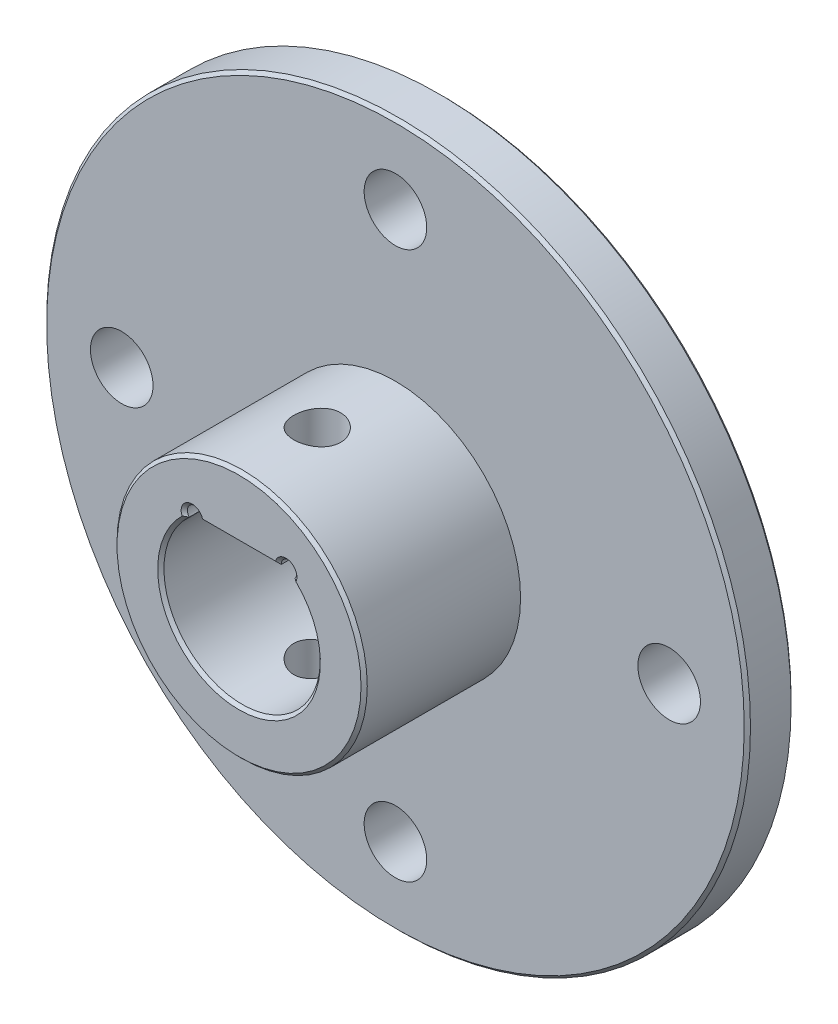
ISO-10303-21;
HEADER;
FILE_DESCRIPTION(('STEP AP214'),'2;1');
FILE_NAME('part.step','',(''),(''),'','','');
FILE_SCHEMA(('AUTOMOTIVE_DESIGN { 1 0 10303 214 1 1 1 1 }'));
ENDSEC;
DATA;
#1=APPLICATION_CONTEXT('core data for automotive mechanical design processes');
#2=APPLICATION_PROTOCOL_DEFINITION('international standard','automotive_design',2000,#1);
#3=PRODUCT_CONTEXT('',#1,'mechanical');
#4=PRODUCT('Part','Part','',(#3));
#5=PRODUCT_RELATED_PRODUCT_CATEGORY('part','',(#4));
#6=PRODUCT_DEFINITION_FORMATION('','',#4);
#7=PRODUCT_DEFINITION_CONTEXT('part definition',#1,'design');
#8=PRODUCT_DEFINITION('design','',#6,#7);
#9=PRODUCT_DEFINITION_SHAPE('','',#8);
#10=(LENGTH_UNIT() NAMED_UNIT(*) SI_UNIT(.MILLI.,.METRE.));
#11=(NAMED_UNIT(*) PLANE_ANGLE_UNIT() SI_UNIT($,.RADIAN.));
#12=(NAMED_UNIT(*) SI_UNIT($,.STERADIAN.) SOLID_ANGLE_UNIT());
#13=UNCERTAINTY_MEASURE_WITH_UNIT(LENGTH_MEASURE(1.E-05),#10,'distance_accuracy_value','');
#14=(GEOMETRIC_REPRESENTATION_CONTEXT(3) GLOBAL_UNCERTAINTY_ASSIGNED_CONTEXT((#13)) GLOBAL_UNIT_ASSIGNED_CONTEXT((#10,
#11,#12)) REPRESENTATION_CONTEXT('',''));
#15=CARTESIAN_POINT('',(0.,0.,0.));
#16=DIRECTION('',(0.,0.,1.));
#17=DIRECTION('',(1.,0.,0.));
#18=AXIS2_PLACEMENT_3D('',#15,#16,#17);
#19=CARTESIAN_POINT('',(0.,0.,3.));
#20=DIRECTION('',(0.,0.,1.));
#21=DIRECTION('',(1.,0.,0.));
#22=AXIS2_PLACEMENT_3D('',#19,#20,#21);
#23=PLANE('',#22);
#24=CARTESIAN_POINT('',(0.,0.,3.));
#25=DIRECTION('',(0.,0.,1.));
#26=DIRECTION('',(1.,0.,0.));
#27=AXIS2_PLACEMENT_3D('',#24,#25,#26);
#28=CIRCLE('',#27,22.3);
#29=CARTESIAN_POINT('',(22.3,0.,3.));
#30=VERTEX_POINT('',#29);
#31=EDGE_CURVE('E11',#30,#30,#28,.T.);
#32=ORIENTED_EDGE('',*,*,#31,.T.);
#33=EDGE_LOOP('',(#32));
#34=FACE_BOUND('',#33,.T.);
#35=CARTESIAN_POINT('',(0.,17.5,3.));
#36=DIRECTION('',(0.,0.,1.));
#37=DIRECTION('',(1.,0.,0.));
#38=AXIS2_PLACEMENT_3D('',#35,#36,#37);
#39=CIRCLE('',#38,2.);
#40=CARTESIAN_POINT('',(2.,17.5,3.));
#41=VERTEX_POINT('',#40);
#42=EDGE_CURVE('E131',#41,#41,#39,.T.);
#43=ORIENTED_EDGE('',*,*,#42,.F.);
#44=EDGE_LOOP('',(#43));
#45=FACE_BOUND('',#44,.T.);
#46=CARTESIAN_POINT('',(17.5,0.,3.));
#47=DIRECTION('',(0.,0.,1.));
#48=DIRECTION('',(1.,0.,0.));
#49=AXIS2_PLACEMENT_3D('',#46,#47,#48);
#50=CIRCLE('',#49,2.);
#51=CARTESIAN_POINT('',(19.5,0.,3.));
#52=VERTEX_POINT('',#51);
#53=EDGE_CURVE('E313',#52,#52,#50,.T.);
#54=ORIENTED_EDGE('',*,*,#53,.F.);
#55=EDGE_LOOP('',(#54));
#56=FACE_BOUND('',#55,.T.);
#57=CARTESIAN_POINT('',(-1.2220184685951E-13,-17.5,3.));
#58=DIRECTION('',(0.,0.,1.));
#59=DIRECTION('',(1.,0.,0.));
#60=AXIS2_PLACEMENT_3D('',#57,#58,#59);
#61=CIRCLE('',#60,2.);
#62=CARTESIAN_POINT('',(1.99999999999988,-17.5,3.));
#63=VERTEX_POINT('',#62);
#64=EDGE_CURVE('E316',#63,#63,#61,.T.);
#65=ORIENTED_EDGE('',*,*,#64,.F.);
#66=EDGE_LOOP('',(#65));
#67=FACE_BOUND('',#66,.T.);
#68=CARTESIAN_POINT('',(-17.5,1.83302770289265E-13,3.));
#69=DIRECTION('',(0.,0.,1.));
#70=DIRECTION('',(1.,0.,0.));
#71=AXIS2_PLACEMENT_3D('',#68,#69,#70);
#72=CIRCLE('',#71,2.);
#73=CARTESIAN_POINT('',(-15.5,1.83302770289265E-13,3.));
#74=VERTEX_POINT('',#73);
#75=EDGE_CURVE('E128',#74,#74,#72,.T.);
#76=ORIENTED_EDGE('',*,*,#75,.F.);
#77=EDGE_LOOP('',(#76));
#78=FACE_BOUND('',#77,.T.);
#79=CARTESIAN_POINT('',(0.,0.,3.));
#80=DIRECTION('',(0.,0.,1.));
#81=DIRECTION('',(1.,0.,0.));
#82=AXIS2_PLACEMENT_3D('',#79,#80,#81);
#83=CIRCLE('',#82,8.);
#84=CARTESIAN_POINT('',(8.,0.,3.));
#85=VERTEX_POINT('',#84);
#86=EDGE_CURVE('E212',#85,#85,#83,.T.);
#87=ORIENTED_EDGE('',*,*,#86,.F.);
#88=EDGE_LOOP('',(#87));
#89=FACE_BOUND('',#88,.T.);
#90=ADVANCED_FACE('F38',(#34,#45,#56,#67,#78,#89),#23,.T.);
#91=CARTESIAN_POINT('',(0.,4.,3.));
#92=DIRECTION('',(0.,-1.,0.));
#93=DIRECTION('',(0.,0.,-1.));
#94=AXIS2_PLACEMENT_3D('',#91,#92,#93);
#95=PLANE('',#94);
#96=CARTESIAN_POINT('',(0.,4.,8.));
#97=DIRECTION('',(0.,-1.,0.));
#98=DIRECTION('',(0.,0.,-1.));
#99=AXIS2_PLACEMENT_3D('',#96,#97,#98);
#100=CIRCLE('',#99,1.5);
#101=CARTESIAN_POINT('',(0.,4.,6.5));
#102=VERTEX_POINT('',#101);
#103=EDGE_CURVE('E172',#102,#102,#100,.T.);
#104=ORIENTED_EDGE('',*,*,#103,.F.);
#105=EDGE_LOOP('',(#104));
#106=FACE_BOUND('',#105,.T.);
#107=DIRECTION('',(0.,0.,-1.));
#108=VECTOR('',#107,1.);
#109=CARTESIAN_POINT('',(2.5,4.,3.));
#110=LINE('',#109,#108);
#111=CARTESIAN_POINT('',(2.5,4.,12.8));
#112=VERTEX_POINT('',#111);
#113=CARTESIAN_POINT('',(2.5,4.,0.));
#114=VERTEX_POINT('',#113);
#115=EDGE_CURVE('E98',#112,#114,#110,.T.);
#116=ORIENTED_EDGE('',*,*,#115,.F.);
#117=DIRECTION('',(-1.,0.,0.));
#118=VECTOR('',#117,1.);
#119=CARTESIAN_POINT('',(0.,4.,12.8));
#120=LINE('',#119,#118);
#121=CARTESIAN_POINT('',(-2.5,4.,12.8));
#122=VERTEX_POINT('',#121);
#123=EDGE_CURVE('E61',#112,#122,#120,.T.);
#124=ORIENTED_EDGE('',*,*,#123,.T.);
#125=DIRECTION('',(0.,0.,-1.));
#126=VECTOR('',#125,1.);
#127=CARTESIAN_POINT('',(-2.5,4.,3.));
#128=LINE('',#127,#126);
#129=CARTESIAN_POINT('',(-2.5,4.,0.));
#130=VERTEX_POINT('',#129);
#131=EDGE_CURVE('E117',#122,#130,#128,.T.);
#132=ORIENTED_EDGE('',*,*,#131,.T.);
#133=DIRECTION('',(-1.,0.,0.));
#134=VECTOR('',#133,1.);
#135=CARTESIAN_POINT('',(0.,4.,0.));
#136=LINE('',#135,#134);
#137=EDGE_CURVE('E111',#114,#130,#136,.T.);
#138=ORIENTED_EDGE('',*,*,#137,.F.);
#139=EDGE_LOOP('',(#116,#124,#132,#138));
#140=FACE_BOUND('',#139,.T.);
#141=ADVANCED_FACE('F116',(#106,#140),#95,.T.);
#142=CARTESIAN_POINT('',(3.,4.,3.));
#143=DIRECTION('',(0.,0.,-1.));
#144=DIRECTION('',(-1.,0.,0.));
#145=AXIS2_PLACEMENT_3D('',#142,#143,#144);
#146=CYLINDRICAL_SURFACE('',#145,0.5);
#147=DIRECTION('',(0.,0.,-1.));
#148=VECTOR('',#147,1.);
#149=CARTESIAN_POINT('',(3.38449968710877,3.68037523466843,3.));
#150=LINE('',#149,#148);
#151=CARTESIAN_POINT('',(3.38449968710877,3.68037523466843,12.8));
#152=VERTEX_POINT('',#151);
#153=CARTESIAN_POINT('',(3.38449968710877,3.68037523466843,0.));
#154=VERTEX_POINT('',#153);
#155=EDGE_CURVE('E105',#152,#154,#150,.T.);
#156=ORIENTED_EDGE('',*,*,#155,.F.);
#157=CARTESIAN_POINT('',(3.,4.,12.8));
#158=DIRECTION('',(0.,0.,1.));
#159=DIRECTION('',(1.,0.,0.));
#160=AXIS2_PLACEMENT_3D('',#157,#158,#159);
#161=CIRCLE('',#160,0.5);
#162=EDGE_CURVE('E69',#152,#112,#161,.T.);
#163=ORIENTED_EDGE('',*,*,#162,.T.);
#164=ORIENTED_EDGE('',*,*,#115,.T.);
#165=CARTESIAN_POINT('',(3.,4.,0.));
#166=DIRECTION('',(0.,0.,1.));
#167=DIRECTION('',(1.,0.,0.));
#168=AXIS2_PLACEMENT_3D('',#165,#166,#167);
#169=CIRCLE('',#168,0.5);
#170=EDGE_CURVE('E101',#114,#154,#169,.F.);
#171=ORIENTED_EDGE('',*,*,#170,.T.);
#172=EDGE_LOOP('',(#156,#163,#164,#171));
#173=FACE_BOUND('',#172,.T.);
#174=ADVANCED_FACE('F100',(#173),#146,.F.);
#175=CARTESIAN_POINT('',(0.,0.,3.));
#176=DIRECTION('',(0.,0.,-1.));
#177=DIRECTION('',(-1.,0.,0.));
#178=AXIS2_PLACEMENT_3D('',#175,#176,#177);
#179=CYLINDRICAL_SURFACE('',#178,5.);
#180=CARTESIAN_POINT('',(0.,-5.,9.5));
#181=CARTESIAN_POINT('',(0.0822886127532999,-4.9999992925055,9.49999900251511));
#182=CARTESIAN_POINT('',(0.164587318351529,-4.99794915693954,9.49320613637603));
#183=CARTESIAN_POINT('',(0.32678812530488,-4.98997105593691,9.4662786457779));
#184=CARTESIAN_POINT('',(0.406689504411419,-4.98404193389692,9.44614004197666));
#185=CARTESIAN_POINT('',(0.561732707754525,-4.96895552501837,9.39325398308974));
#186=CARTESIAN_POINT('',(0.636881364395372,-4.95980300250425,9.36052513038107));
#187=CARTESIAN_POINT('',(0.78062418105313,-4.93922109237645,9.28346390694417));
#188=CARTESIAN_POINT('',(0.849217467469668,-4.92779140192067,9.23912999260458));
#189=CARTESIAN_POINT('',(0.979871797183744,-4.90350737192774,9.13877599252733));
#190=CARTESIAN_POINT('',(1.04171807124434,-4.89062383657036,9.08248337411409));
#191=CARTESIAN_POINT('',(1.15524920923324,-4.86505834210442,8.96039077008982));
#192=CARTESIAN_POINT('',(1.20693236327441,-4.85237641724502,8.89458918787504));
#193=CARTESIAN_POINT('',(1.29980037723708,-4.82834113993772,8.75352924696239));
#194=CARTESIAN_POINT('',(1.34072309022213,-4.81702406663875,8.67809153900926));
#195=CARTESIAN_POINT('',(1.4092139477476,-4.79743620394031,8.52101074576971));
#196=CARTESIAN_POINT('',(1.43678529919973,-4.78916468313311,8.43936915607203));
#197=CARTESIAN_POINT('',(1.47701633682652,-4.77690870838434,8.27460973386954));
#198=CARTESIAN_POINT('',(1.49007196234677,-4.77281069324533,8.19159725613606));
#199=CARTESIAN_POINT('',(1.50213730614672,-4.76902789749767,8.02446684378324));
#200=CARTESIAN_POINT('',(1.50115042761078,-4.76934204760571,7.94034918194092));
#201=CARTESIAN_POINT('',(1.48546977199812,-4.77424744067778,7.77661609139152));
#202=CARTESIAN_POINT('',(1.47127205262685,-4.77868388599141,7.69694774963776));
#203=CARTESIAN_POINT('',(1.43037420427056,-4.79108356228624,7.54118021372654));
#204=CARTESIAN_POINT('',(1.40367284141641,-4.79904714132351,7.46508137262567));
#205=CARTESIAN_POINT('',(1.33816026653682,-4.81772733074973,7.31739965033926));
#206=CARTESIAN_POINT('',(1.29918816934642,-4.82848016115952,7.24589291604474));
#207=CARTESIAN_POINT('',(1.21035222588683,-4.85150987000065,7.11026797798981));
#208=CARTESIAN_POINT('',(1.16048574002588,-4.86378711746991,7.04615157058622));
#209=CARTESIAN_POINT('',(1.04881290765546,-4.88911011297937,6.92431380923798));
#210=CARTESIAN_POINT('',(0.986594907466972,-4.90216654310498,6.86697133597033));
#211=CARTESIAN_POINT('',(0.853263259313967,-4.92712244063259,6.76344601593575));
#212=CARTESIAN_POINT('',(0.782149051860887,-4.9390218351841,6.71726387158557));
#213=CARTESIAN_POINT('',(0.632355038342802,-4.96043160069471,6.63714007753527));
#214=CARTESIAN_POINT('',(0.553627749747949,-4.96992543668314,6.60328248375014));
#215=CARTESIAN_POINT('',(0.391245415603518,-4.98533521832222,6.54940040990037));
#216=CARTESIAN_POINT('',(0.307591751589581,-4.99125216186999,6.52937207146751));
#217=CARTESIAN_POINT('',(0.140952242668331,-4.99868364643538,6.50434782210061));
#218=CARTESIAN_POINT('',(0.058050097601187,-5.0003485041779,6.49883841419839));
#219=CARTESIAN_POINT('',(-0.107499605823383,-4.9995292324176,6.50156915571208));
#220=CARTESIAN_POINT('',(-0.19014719669078,-4.99704565677757,6.50980746965144));
#221=CARTESIAN_POINT('',(-0.350903605309696,-4.98830696987163,6.5393846111115));
#222=CARTESIAN_POINT('',(-0.429072772614169,-4.98213829799417,6.56042338758087));
#223=CARTESIAN_POINT('',(-0.580754638954521,-4.96674347841533,6.6146432327782));
#224=CARTESIAN_POINT('',(-0.654266777025583,-4.95751696321085,6.64782576103786));
#225=CARTESIAN_POINT('',(-0.796437189461051,-4.93669654351325,6.72625316548113));
#226=CARTESIAN_POINT('',(-0.864943826199669,-4.92505280829675,6.77175934094797));
#227=CARTESIAN_POINT('',(-0.993523307980146,-4.90073468764318,6.87322475405281));
#228=CARTESIAN_POINT('',(-1.05359403235593,-4.8880600443108,6.92918661188767));
#229=CARTESIAN_POINT('',(-1.16585744551027,-4.86253171869138,7.05238730836934));
#230=CARTESIAN_POINT('',(-1.21768481231503,-4.84968825033268,7.11996187577174));
#231=CARTESIAN_POINT('',(-1.30928995072153,-4.82576515238464,7.26312793901353));
#232=CARTESIAN_POINT('',(-1.34906803829472,-4.81468547654651,7.33871922455821));
#233=CARTESIAN_POINT('',(-1.41517347127168,-4.79567189615055,7.49553249125469));
#234=CARTESIAN_POINT('',(-1.4415634693705,-4.78772337843827,7.57672618653659));
#235=CARTESIAN_POINT('',(-1.48021730815114,-4.77591594362794,7.74268796893147));
#236=CARTESIAN_POINT('',(-1.49248598978779,-4.772055625083,7.82745482078767));
#237=CARTESIAN_POINT('',(-1.50221984485059,-4.76899972496087,7.99436151837623));
#238=CARTESIAN_POINT('',(-1.5002805530849,-4.76961647442755,8.07646365101759));
#239=CARTESIAN_POINT('',(-1.48307505444813,-4.77499401288294,8.2391141033728));
#240=CARTESIAN_POINT('',(-1.46780938124716,-4.77975463592551,8.31966248517635));
#241=CARTESIAN_POINT('',(-1.42476888804136,-4.79275763670386,8.47594539914285));
#242=CARTESIAN_POINT('',(-1.39715175507068,-4.80095604545965,8.55172728736169));
#243=CARTESIAN_POINT('',(-1.33031507121129,-4.81990278909136,8.69764243881772));
#244=CARTESIAN_POINT('',(-1.29109329962876,-4.83065161194312,8.76777461764076));
#245=CARTESIAN_POINT('',(-1.20048763805072,-4.85397676425833,8.90316311652711));
#246=CARTESIAN_POINT('',(-1.14871276092994,-4.86660540163798,8.96814876126041));
#247=CARTESIAN_POINT('',(-1.03517434629782,-4.89201320450026,9.08870249830786));
#248=CARTESIAN_POINT('',(-0.973408217134501,-4.90479240823905,9.14426813946776));
#249=CARTESIAN_POINT('',(-0.839465762183248,-4.92950936570649,9.24602341229503));
#250=CARTESIAN_POINT('',(-0.767037885790607,-4.94141159765674,9.29189144685549));
#251=CARTESIAN_POINT('',(-0.615141373983529,-4.96260680455813,9.37073516990403));
#252=CARTESIAN_POINT('',(-0.535676052998955,-4.97190099931067,9.40371688827451));
#253=CARTESIAN_POINT('',(-0.380757712655281,-4.98602174969301,9.45289527565275));
#254=CARTESIAN_POINT('',(-0.305786961954234,-4.99122027381068,9.47051167288325));
#255=CARTESIAN_POINT('',(-0.153880195230779,-4.99820944494492,9.49406352524158));
#256=CARTESIAN_POINT('',(-0.0769445098581395,-5.0000006615474,9.50000093270482));
#257=CARTESIAN_POINT('',(0.,-5.,9.5));
#258=B_SPLINE_CURVE_WITH_KNOTS('',3,(#180,#181,#182,#183,#184,#185,#186,#187,#188,#189,#190,
#191,#192,#193,#194,#195,#196,#197,#198,#199,#200,#201,#202,#203,#204,#205,#206,#207,#208,#209,
#210,#211,#212,#213,#214,#215,#216,#217,#218,#219,#220,#221,#222,#223,#224,#225,#226,#227,#228,
#229,#230,#231,#232,#233,#234,#235,#236,#237,#238,#239,#240,#241,#242,#243,#244,#245,#246,#247,
#248,#249,#250,#251,#252,#253,#254,#255,#256,#257),.UNSPECIFIED.,.T.,.F.,(4,2,2,2,2,2,2,2,2,2,2,
2,2,2,2,2,2,2,2,2,2,2,2,2,2,2,2,2,2,2,2,2,2,2,2,2,2,2,4),(0.,0.24658320361261,0.493239964845999,
0.739533676300872,0.9858601644127,1.23855602948191,1.49129437288633,1.74971481004109,
2.00807314543223,2.25919689356599,2.51025978319089,2.75226016697676,2.99428443658001,
3.2396242644712,3.48502360158555,3.74067104048167,3.99633456531072,4.25371046881689,
4.51101453528808,4.75908809438545,5.00712853550327,5.24956746682327,5.49203554593728,
5.74011305702908,5.98825282000191,6.24540400322818,6.5025484425268,6.75847814951251,
7.01432009460283,7.25950155466943,7.504673196616,7.74680040402721,7.98897397553107,
8.23996925679931,8.49102974897502,8.74942996156671,9.00770911595235,9.23831691930459,
9.46888616948874),.UNSPECIFIED.);
#259=CARTESIAN_POINT('',(0.,-5.,9.5));
#260=VERTEX_POINT('',#259);
#261=EDGE_CURVE('E236',#260,#260,#258,.T.);
#262=ORIENTED_EDGE('',*,*,#261,.F.);
#263=EDGE_LOOP('',(#262));
#264=FACE_BOUND('',#263,.T.);
#265=DIRECTION('',(0.,0.,-1.));
#266=VECTOR('',#265,1.);
#267=CARTESIAN_POINT('',(-3.38449968710876,3.68037523466843,3.));
#268=LINE('',#267,#266);
#269=CARTESIAN_POINT('',(-3.38449968710876,3.68037523466843,12.8));
#270=VERTEX_POINT('',#269);
#271=CARTESIAN_POINT('',(-3.38449968710876,3.68037523466843,0.));
#272=VERTEX_POINT('',#271);
#273=EDGE_CURVE('E130',#270,#272,#268,.T.);
#274=ORIENTED_EDGE('',*,*,#273,.F.);
#275=CARTESIAN_POINT('',(0.,0.,12.8));
#276=DIRECTION('',(0.,0.,1.));
#277=DIRECTION('',(1.,0.,0.));
#278=AXIS2_PLACEMENT_3D('',#275,#276,#277);
#279=CIRCLE('',#278,5.);
#280=EDGE_CURVE('E104',#270,#152,#279,.T.);
#281=ORIENTED_EDGE('',*,*,#280,.T.);
#282=ORIENTED_EDGE('',*,*,#155,.T.);
#283=CARTESIAN_POINT('',(0.,0.,0.));
#284=DIRECTION('',(0.,0.,1.));
#285=DIRECTION('',(1.,0.,0.));
#286=AXIS2_PLACEMENT_3D('',#283,#284,#285);
#287=CIRCLE('',#286,5.);
#288=EDGE_CURVE('E114',#272,#154,#287,.T.);
#289=ORIENTED_EDGE('',*,*,#288,.F.);
#290=EDGE_LOOP('',(#274,#281,#282,#289));
#291=FACE_BOUND('',#290,.T.);
#292=ADVANCED_FACE('F244',(#264,#291),#179,.F.);
#293=CARTESIAN_POINT('',(0.,0.,3.));
#294=DIRECTION('',(0.,0.,-1.));
#295=DIRECTION('',(-1.,0.,0.));
#296=AXIS2_PLACEMENT_3D('',#293,#294,#295);
#297=CYLINDRICAL_SURFACE('',#296,22.5);
#298=CARTESIAN_POINT('',(0.,0.,0.200000000000002));
#299=DIRECTION('',(0.,0.,1.));
#300=DIRECTION('',(1.,0.,0.));
#301=AXIS2_PLACEMENT_3D('',#298,#299,#300);
#302=CIRCLE('',#301,22.5);
#303=CARTESIAN_POINT('',(22.5,0.,0.200000000000002));
#304=VERTEX_POINT('',#303);
#305=EDGE_CURVE('E158',#304,#304,#302,.T.);
#306=ORIENTED_EDGE('',*,*,#305,.T.);
#307=EDGE_LOOP('',(#306));
#308=FACE_BOUND('',#307,.T.);
#309=CARTESIAN_POINT('',(0.,0.,2.8));
#310=DIRECTION('',(0.,0.,1.));
#311=DIRECTION('',(1.,0.,0.));
#312=AXIS2_PLACEMENT_3D('',#309,#310,#311);
#313=CIRCLE('',#312,22.5);
#314=CARTESIAN_POINT('',(22.5,0.,2.8));
#315=VERTEX_POINT('',#314);
#316=EDGE_CURVE('E155',#315,#315,#313,.F.);
#317=ORIENTED_EDGE('',*,*,#316,.T.);
#318=EDGE_LOOP('',(#317));
#319=FACE_BOUND('',#318,.T.);
#320=ADVANCED_FACE('F249',(#308,#319),#297,.T.);
#321=CARTESIAN_POINT('',(0.,17.5,3.));
#322=DIRECTION('',(0.,0.,-1.));
#323=DIRECTION('',(-1.,0.,0.));
#324=AXIS2_PLACEMENT_3D('',#321,#322,#323);
#325=CYLINDRICAL_SURFACE('',#324,2.);
#326=ORIENTED_EDGE('',*,*,#42,.T.);
#327=EDGE_LOOP('',(#326));
#328=FACE_BOUND('',#327,.T.);
#329=CARTESIAN_POINT('',(0.,17.5,0.));
#330=DIRECTION('',(0.,0.,1.));
#331=DIRECTION('',(1.,0.,0.));
#332=AXIS2_PLACEMENT_3D('',#329,#330,#331);
#333=CIRCLE('',#332,2.);
#334=CARTESIAN_POINT('',(2.,17.5,0.));
#335=VERTEX_POINT('',#334);
#336=EDGE_CURVE('E118',#335,#335,#333,.T.);
#337=ORIENTED_EDGE('',*,*,#336,.F.);
#338=EDGE_LOOP('',(#337));
#339=FACE_BOUND('',#338,.T.);
#340=ADVANCED_FACE('F260',(#328,#339),#325,.F.);
#341=CARTESIAN_POINT('',(17.5,0.,3.));
#342=DIRECTION('',(0.,0.,-1.));
#343=DIRECTION('',(-1.,0.,0.));
#344=AXIS2_PLACEMENT_3D('',#341,#342,#343);
#345=CYLINDRICAL_SURFACE('',#344,2.);
#346=ORIENTED_EDGE('',*,*,#53,.T.);
#347=EDGE_LOOP('',(#346));
#348=FACE_BOUND('',#347,.T.);
#349=CARTESIAN_POINT('',(17.5,0.,0.));
#350=DIRECTION('',(0.,0.,1.));
#351=DIRECTION('',(1.,0.,0.));
#352=AXIS2_PLACEMENT_3D('',#349,#350,#351);
#353=CIRCLE('',#352,2.);
#354=CARTESIAN_POINT('',(19.5,0.,0.));
#355=VERTEX_POINT('',#354);
#356=EDGE_CURVE('E121',#355,#355,#353,.T.);
#357=ORIENTED_EDGE('',*,*,#356,.F.);
#358=EDGE_LOOP('',(#357));
#359=FACE_BOUND('',#358,.T.);
#360=ADVANCED_FACE('F264',(#348,#359),#345,.F.);
#361=CARTESIAN_POINT('',(-1.2220184685951E-13,-17.5,3.));
#362=DIRECTION('',(0.,0.,-1.));
#363=DIRECTION('',(-1.,0.,0.));
#364=AXIS2_PLACEMENT_3D('',#361,#362,#363);
#365=CYLINDRICAL_SURFACE('',#364,2.);
#366=ORIENTED_EDGE('',*,*,#64,.T.);
#367=EDGE_LOOP('',(#366));
#368=FACE_BOUND('',#367,.T.);
#369=CARTESIAN_POINT('',(-1.2220184685951E-13,-17.5,0.));
#370=DIRECTION('',(0.,0.,1.));
#371=DIRECTION('',(1.,0.,0.));
#372=AXIS2_PLACEMENT_3D('',#369,#370,#371);
#373=CIRCLE('',#372,2.);
#374=CARTESIAN_POINT('',(1.99999999999988,-17.5,0.));
#375=VERTEX_POINT('',#374);
#376=EDGE_CURVE('E301',#375,#375,#373,.T.);
#377=ORIENTED_EDGE('',*,*,#376,.F.);
#378=EDGE_LOOP('',(#377));
#379=FACE_BOUND('',#378,.T.);
#380=ADVANCED_FACE('F268',(#368,#379),#365,.F.);
#381=CARTESIAN_POINT('',(-17.5,1.83302770289265E-13,3.));
#382=DIRECTION('',(0.,0.,-1.));
#383=DIRECTION('',(-1.,0.,0.));
#384=AXIS2_PLACEMENT_3D('',#381,#382,#383);
#385=CYLINDRICAL_SURFACE('',#384,2.);
#386=ORIENTED_EDGE('',*,*,#75,.T.);
#387=EDGE_LOOP('',(#386));
#388=FACE_BOUND('',#387,.T.);
#389=CARTESIAN_POINT('',(-17.5,1.83302770289265E-13,0.));
#390=DIRECTION('',(0.,0.,1.));
#391=DIRECTION('',(1.,0.,0.));
#392=AXIS2_PLACEMENT_3D('',#389,#390,#391);
#393=CIRCLE('',#392,2.);
#394=CARTESIAN_POINT('',(-15.5,1.83302770289265E-13,0.));
#395=VERTEX_POINT('',#394);
#396=EDGE_CURVE('E297',#395,#395,#393,.T.);
#397=ORIENTED_EDGE('',*,*,#396,.F.);
#398=EDGE_LOOP('',(#397));
#399=FACE_BOUND('',#398,.T.);
#400=ADVANCED_FACE('F271',(#388,#399),#385,.F.);
#401=CARTESIAN_POINT('',(-3.,4.,3.));
#402=DIRECTION('',(0.,0.,-1.));
#403=DIRECTION('',(-1.,0.,0.));
#404=AXIS2_PLACEMENT_3D('',#401,#402,#403);
#405=CYLINDRICAL_SURFACE('',#404,0.5);
#406=ORIENTED_EDGE('',*,*,#131,.F.);
#407=CARTESIAN_POINT('',(-3.,4.,12.8));
#408=DIRECTION('',(0.,0.,1.));
#409=DIRECTION('',(1.,0.,0.));
#410=AXIS2_PLACEMENT_3D('',#407,#408,#409);
#411=CIRCLE('',#410,0.5);
#412=EDGE_CURVE('E149',#122,#270,#411,.T.);
#413=ORIENTED_EDGE('',*,*,#412,.T.);
#414=ORIENTED_EDGE('',*,*,#273,.T.);
#415=CARTESIAN_POINT('',(-3.,4.,0.));
#416=DIRECTION('',(0.,0.,1.));
#417=DIRECTION('',(1.,0.,0.));
#418=AXIS2_PLACEMENT_3D('',#415,#416,#417);
#419=CIRCLE('',#418,0.5);
#420=EDGE_CURVE('E126',#130,#272,#419,.T.);
#421=ORIENTED_EDGE('',*,*,#420,.F.);
#422=EDGE_LOOP('',(#406,#413,#414,#421));
#423=FACE_BOUND('',#422,.T.);
#424=ADVANCED_FACE('F251',(#423),#405,.F.);
#425=CARTESIAN_POINT('',(0.,0.,0.));
#426=DIRECTION('',(0.,0.,1.));
#427=DIRECTION('',(1.,0.,0.));
#428=AXIS2_PLACEMENT_3D('',#425,#426,#427);
#429=PLANE('',#428);
#430=CARTESIAN_POINT('',(0.,0.,0.));
#431=DIRECTION('',(0.,0.,1.));
#432=DIRECTION('',(1.,0.,0.));
#433=AXIS2_PLACEMENT_3D('',#430,#431,#432);
#434=CIRCLE('',#433,22.3);
#435=CARTESIAN_POINT('',(22.3,0.,0.));
#436=VERTEX_POINT('',#435);
#437=EDGE_CURVE('E53',#436,#436,#434,.F.);
#438=ORIENTED_EDGE('',*,*,#437,.T.);
#439=EDGE_LOOP('',(#438));
#440=FACE_BOUND('',#439,.T.);
#441=ORIENTED_EDGE('',*,*,#396,.T.);
#442=EDGE_LOOP('',(#441));
#443=FACE_BOUND('',#442,.T.);
#444=ORIENTED_EDGE('',*,*,#376,.T.);
#445=EDGE_LOOP('',(#444));
#446=FACE_BOUND('',#445,.T.);
#447=ORIENTED_EDGE('',*,*,#356,.T.);
#448=EDGE_LOOP('',(#447));
#449=FACE_BOUND('',#448,.T.);
#450=ORIENTED_EDGE('',*,*,#336,.T.);
#451=EDGE_LOOP('',(#450));
#452=FACE_BOUND('',#451,.T.);
#453=ORIENTED_EDGE('',*,*,#137,.T.);
#454=ORIENTED_EDGE('',*,*,#420,.T.);
#455=ORIENTED_EDGE('',*,*,#288,.T.);
#456=ORIENTED_EDGE('',*,*,#170,.F.);
#457=EDGE_LOOP('',(#453,#454,#455,#456));
#458=FACE_BOUND('',#457,.T.);
#459=ADVANCED_FACE('F109',(#440,#443,#446,#449,#452,#458),#429,.F.);
#460=CARTESIAN_POINT('',(0.,0.,13.));
#461=DIRECTION('',(0.,0.,1.));
#462=DIRECTION('',(1.,0.,0.));
#463=AXIS2_PLACEMENT_3D('',#460,#461,#462);
#464=PLANE('',#463);
#465=CARTESIAN_POINT('',(3.,4.,13.));
#466=DIRECTION('',(0.,0.,1.));
#467=DIRECTION('',(1.,0.,0.));
#468=AXIS2_PLACEMENT_3D('',#465,#466,#467);
#469=CIRCLE('',#468,0.699999999999999);
#470=CARTESIAN_POINT('',(2.32917960675006,4.2,13.));
#471=VERTEX_POINT('',#470);
#472=CARTESIAN_POINT('',(3.63909889214317,3.71442583089262,13.));
#473=VERTEX_POINT('',#472);
#474=EDGE_CURVE('E143',#471,#473,#469,.F.);
#475=ORIENTED_EDGE('',*,*,#474,.T.);
#476=CARTESIAN_POINT('',(0.,0.,13.));
#477=DIRECTION('',(0.,0.,1.));
#478=DIRECTION('',(1.,0.,0.));
#479=AXIS2_PLACEMENT_3D('',#476,#477,#478);
#480=CIRCLE('',#479,5.2);
#481=CARTESIAN_POINT('',(-3.63909889214317,3.71442583089262,13.));
#482=VERTEX_POINT('',#481);
#483=EDGE_CURVE('E145',#473,#482,#480,.F.);
#484=ORIENTED_EDGE('',*,*,#483,.T.);
#485=CARTESIAN_POINT('',(-3.,4.,13.));
#486=DIRECTION('',(0.,0.,1.));
#487=DIRECTION('',(1.,0.,0.));
#488=AXIS2_PLACEMENT_3D('',#485,#486,#487);
#489=CIRCLE('',#488,0.699999999999998);
#490=CARTESIAN_POINT('',(-2.32917960675006,4.2,13.));
#491=VERTEX_POINT('',#490);
#492=EDGE_CURVE('E141',#482,#491,#489,.F.);
#493=ORIENTED_EDGE('',*,*,#492,.T.);
#494=DIRECTION('',(1.,0.,0.));
#495=VECTOR('',#494,1.);
#496=CARTESIAN_POINT('',(0.,4.2,13.));
#497=LINE('',#496,#495);
#498=EDGE_CURVE('E139',#491,#471,#497,.T.);
#499=ORIENTED_EDGE('',*,*,#498,.T.);
#500=EDGE_LOOP('',(#475,#484,#493,#499));
#501=FACE_BOUND('',#500,.T.);
#502=CARTESIAN_POINT('',(0.,0.,13.));
#503=DIRECTION('',(0.,0.,1.));
#504=DIRECTION('',(1.,0.,0.));
#505=AXIS2_PLACEMENT_3D('',#502,#503,#504);
#506=CIRCLE('',#505,7.8);
#507=CARTESIAN_POINT('',(7.8,0.,13.));
#508=VERTEX_POINT('',#507);
#509=EDGE_CURVE('E136',#508,#508,#506,.T.);
#510=ORIENTED_EDGE('',*,*,#509,.T.);
#511=EDGE_LOOP('',(#510));
#512=FACE_BOUND('',#511,.T.);
#513=ADVANCED_FACE('F232',(#501,#512),#464,.T.);
#514=CARTESIAN_POINT('',(0.,0.,13.));
#515=DIRECTION('',(0.,0.,-1.));
#516=DIRECTION('',(-1.,0.,0.));
#517=AXIS2_PLACEMENT_3D('',#514,#515,#516);
#518=CYLINDRICAL_SURFACE('',#517,8.);
#519=CARTESIAN_POINT('',(0.,-8.,9.5));
#520=CARTESIAN_POINT('',(0.0834717464654707,-7.99999848833852,9.49999681041172));
#521=CARTESIAN_POINT('',(0.166984992730098,-7.99868009921714,9.49300892338062));
#522=CARTESIAN_POINT('',(0.331658129841797,-7.9935478589052,9.46526000488165));
#523=CARTESIAN_POINT('',(0.412815974152225,-7.98973190166897,9.44448734936027));
#524=CARTESIAN_POINT('',(0.5703729618518,-7.98003138765458,9.38982729874066));
#525=CARTESIAN_POINT('',(0.646776330685343,-7.97414869946483,9.35595174754746));
#526=CARTESIAN_POINT('',(0.792807973094005,-7.96095710599783,9.27608112307718));
#527=CARTESIAN_POINT('',(0.862436794477322,-7.9536483161829,9.23008703085518));
#528=CARTESIAN_POINT('',(0.993783715930501,-7.93831336430504,9.12670023199633));
#529=CARTESIAN_POINT('',(1.05540895503183,-7.93028034856351,9.06919055532986));
#530=CARTESIAN_POINT('',(1.16819606135369,-7.9144531845865,8.94465669091244));
#531=CARTESIAN_POINT('',(1.21935717689241,-7.90665905354528,8.87763182023071));
#532=CARTESIAN_POINT('',(1.31014998665793,-7.89212551245006,8.73531391163603));
#533=CARTESIAN_POINT('',(1.34968721969605,-7.88539493886182,8.65995962968277));
#534=CARTESIAN_POINT('',(1.41550524332283,-7.87384713211987,8.50353108482321));
#535=CARTESIAN_POINT('',(1.44178717713098,-7.86902973396962,8.42245731588878));
#536=CARTESIAN_POINT('',(1.480050535035,-7.8619226957455,8.25788476908559));
#537=CARTESIAN_POINT('',(1.49219390192039,-7.85960445366405,8.17442490279654));
#538=CARTESIAN_POINT('',(1.50233808095346,-7.85767197152761,8.00662261519175));
#539=CARTESIAN_POINT('',(1.50034016135374,-7.8580574889876,7.9222802736977));
#540=CARTESIAN_POINT('',(1.48238979602362,-7.86146292701753,7.75628047473396));
#541=CARTESIAN_POINT('',(1.46662149996045,-7.86444808147334,7.67460228569985));
#542=CARTESIAN_POINT('',(1.42186799396207,-7.87266183284666,7.51507158021739));
#543=CARTESIAN_POINT('',(1.39288222239499,-7.87789052509516,7.4372192264907));
#544=CARTESIAN_POINT('',(1.322336471793,-7.89003855292588,7.28701132099974));
#545=CARTESIAN_POINT('',(1.28070213532456,-7.89696783823366,7.21469152941919));
#546=CARTESIAN_POINT('',(1.18609368930416,-7.91172971602918,7.07799527145977));
#547=CARTESIAN_POINT('',(1.13311842889266,-7.91956240015522,7.0136196122852));
#548=CARTESIAN_POINT('',(1.01633905685298,-7.93540001272164,6.89357504432754));
#549=CARTESIAN_POINT('',(0.952377436860682,-7.9434057102403,6.83805934754826));
#550=CARTESIAN_POINT('',(0.815968037098826,-7.95857386108318,6.7385227593246));
#551=CARTESIAN_POINT('',(0.74352017225577,-7.96573630595245,6.69450198312958));
#552=CARTESIAN_POINT('',(0.592034988874669,-7.97842539677509,6.61918224612998));
#553=CARTESIAN_POINT('',(0.512989564446495,-7.98394999136289,6.58789922088211));
#554=CARTESIAN_POINT('',(0.350639115398698,-7.99272505402719,6.53909790690784));
#555=CARTESIAN_POINT('',(0.267334544277789,-7.99597576367994,6.52157815595464));
#556=CARTESIAN_POINT('',(0.100148652903387,-7.99980360641981,6.50101396898173));
#557=CARTESIAN_POINT('',(0.016294012634137,-8.00041950912279,6.49775960847027));
#558=CARTESIAN_POINT('',(-0.150761248092182,-7.99901543598228,6.50525547954765));
#559=CARTESIAN_POINT('',(-0.233961900480384,-7.99699558964431,6.51600502306526));
#560=CARTESIAN_POINT('',(-0.396681573218215,-7.99057111500406,6.55102903518337));
#561=CARTESIAN_POINT('',(-0.476224261046061,-7.98618522374031,6.57519728253781));
#562=CARTESIAN_POINT('',(-0.630128631824631,-7.97551842212498,6.63625770677879));
#563=CARTESIAN_POINT('',(-0.704489962595101,-7.96923738311334,6.67315074756578));
#564=CARTESIAN_POINT('',(-0.846816671513212,-7.95538030357666,6.75907812815951));
#565=CARTESIAN_POINT('',(-0.914703277015119,-7.94779086174563,6.80824073853684));
#566=CARTESIAN_POINT('',(-1.04133832326454,-7.93219343489712,6.91713813736236));
#567=CARTESIAN_POINT('',(-1.10008590976086,-7.92418541084687,6.97687391300133));
#568=CARTESIAN_POINT('',(-1.20757295872048,-7.9085247569745,7.10617231891142));
#569=CARTESIAN_POINT('',(-1.25616916218576,-7.90087825860257,7.17585490812538));
#570=CARTESIAN_POINT('',(-1.34096675057787,-7.88692985578532,7.32251762452375));
#571=CARTESIAN_POINT('',(-1.37716859613924,-7.8806279013735,7.39949748037047));
#572=CARTESIAN_POINT('',(-1.43594673512823,-7.87013024209574,7.55820586724253));
#573=CARTESIAN_POINT('',(-1.45858868794786,-7.86592440436878,7.63990937955933));
#574=CARTESIAN_POINT('',(-1.48980679326235,-7.86007203802415,7.8060472225214));
#575=CARTESIAN_POINT('',(-1.49838453270708,-7.8584252206579,7.8904812439704));
#576=CARTESIAN_POINT('',(-1.50117762148355,-7.85789199803857,8.05824833144151));
#577=CARTESIAN_POINT('',(-1.49561895003499,-7.85896215974293,8.14157758095699));
#578=CARTESIAN_POINT('',(-1.47079175378803,-7.86364600659998,8.30609142204529));
#579=CARTESIAN_POINT('',(-1.45152331089332,-7.86725967655747,8.38727602642744));
#580=CARTESIAN_POINT('',(-1.39991887583263,-7.8766050802318,8.54507448479548));
#581=CARTESIAN_POINT('',(-1.36760735397252,-7.88233284594965,8.62169659134577));
#582=CARTESIAN_POINT('',(-1.29085868912204,-7.8952638755184,8.76846825424084));
#583=CARTESIAN_POINT('',(-1.24642068948186,-7.90246724360119,8.83861735284478));
#584=CARTESIAN_POINT('',(-1.14589487339535,-7.91767266107745,8.97158368004229));
#585=CARTESIAN_POINT('',(-1.08964259864304,-7.92568505353043,9.0342754125671));
#586=CARTESIAN_POINT('',(-0.967427926742292,-7.94152833918735,9.14940516246452));
#587=CARTESIAN_POINT('',(-0.901463301891617,-7.94935919027328,9.20184082098014));
#588=CARTESIAN_POINT('',(-0.760984945071874,-7.96403975968049,9.29541095262706));
#589=CARTESIAN_POINT('',(-0.686399590640518,-7.97088000990561,9.33643942849064));
#590=CARTESIAN_POINT('',(-0.531290113653836,-7.98271619380687,9.40531763660513));
#591=CARTESIAN_POINT('',(-0.45077165170525,-7.98771385879037,9.43317974704691));
#592=CARTESIAN_POINT('',(-0.308347202825156,-7.99428290707632,9.46927731441867));
#593=CARTESIAN_POINT('',(-0.247273810251872,-7.99641470878206,9.4807786303128));
#594=CARTESIAN_POINT('',(-0.124141247115159,-7.9992737995401,9.49614106211645));
#595=CARTESIAN_POINT('',(-0.0620821016527099,-8.00000112429805,9.50000237225591));
#596=CARTESIAN_POINT('',(0.,-8.,9.5));
#597=B_SPLINE_CURVE_WITH_KNOTS('',3,(#519,#520,#521,#522,#523,#524,#525,#526,#527,#528,#529,
#530,#531,#532,#533,#534,#535,#536,#537,#538,#539,#540,#541,#542,#543,#544,#545,#546,#547,#548,
#549,#550,#551,#552,#553,#554,#555,#556,#557,#558,#559,#560,#561,#562,#563,#564,#565,#566,#567,
#568,#569,#570,#571,#572,#573,#574,#575,#576,#577,#578,#579,#580,#581,#582,#583,#584,#585,#586,
#587,#588,#589,#590,#591,#592,#593,#594,#595,#596),.UNSPECIFIED.,.T.,.F.,(4,2,2,2,2,2,2,2,2,2,2,
2,2,2,2,2,2,2,2,2,2,2,2,2,2,2,2,2,2,2,2,2,2,2,2,2,2,2,4),(0.,0.250188200964924,
0.500587642535451,0.750761271230906,1.00091465336891,1.2537511801363,1.50660586283616,
1.76146190504357,2.01629596311948,2.26818151445336,2.52004447587256,2.76859000612765,
3.01714609846786,3.2671926262953,3.51726454049859,3.77127768464077,4.02529337544948,
4.27962588321699,4.53393136673745,4.78448174076096,5.03501980464583,5.28360233907828,
5.53220175338031,5.78351778017708,6.03485728413098,6.28953436987299,6.54420198954945,
6.79762627818559,7.05102196946512,7.30039252231748,7.54976158541507,7.79866496207692,
8.04758592655423,8.3002336996638,8.55293951262255,8.80792048916314,9.06266126931173,
9.24874344524409,9.4348208903954),.UNSPECIFIED.);
#598=CARTESIAN_POINT('',(0.,-8.,9.5));
#599=VERTEX_POINT('',#598);
#600=EDGE_CURVE('E43',#599,#599,#597,.T.);
#601=ORIENTED_EDGE('',*,*,#600,.T.);
#602=EDGE_LOOP('',(#601));
#603=FACE_BOUND('',#602,.T.);
#604=CARTESIAN_POINT('',(0.,8.,9.5));
#605=CARTESIAN_POINT('',(-0.083471746465471,7.99999848833852,9.49999681041172));
#606=CARTESIAN_POINT('',(-0.166984992730099,7.99868009921714,9.49300892338062));
#607=CARTESIAN_POINT('',(-0.331658129841798,7.9935478589052,9.46526000488165));
#608=CARTESIAN_POINT('',(-0.412815974152226,7.98973190166897,9.44448734936027));
#609=CARTESIAN_POINT('',(-0.570372961851802,7.98003138765458,9.38982729874066));
#610=CARTESIAN_POINT('',(-0.646776330685344,7.97414869946483,9.35595174754746));
#611=CARTESIAN_POINT('',(-0.792807973094007,7.96095710599783,9.27608112307718));
#612=CARTESIAN_POINT('',(-0.862436794477323,7.9536483161829,9.23008703085518));
#613=CARTESIAN_POINT('',(-0.993783715930503,7.93831336430504,9.12670023199632));
#614=CARTESIAN_POINT('',(-1.05540895503183,7.93028034856351,9.06919055532986));
#615=CARTESIAN_POINT('',(-1.16819606135369,7.9144531845865,8.94465669091244));
#616=CARTESIAN_POINT('',(-1.21935717689241,7.90665905354527,8.87763182023071));
#617=CARTESIAN_POINT('',(-1.31014998665793,7.89212551245005,8.73531391163603));
#618=CARTESIAN_POINT('',(-1.34968721969605,7.88539493886182,8.65995962968276));
#619=CARTESIAN_POINT('',(-1.41550524332283,7.87384713211987,8.50353108482321));
#620=CARTESIAN_POINT('',(-1.44178717713098,7.86902973396962,8.42245731588878));
#621=CARTESIAN_POINT('',(-1.480050535035,7.8619226957455,8.25788476908559));
#622=CARTESIAN_POINT('',(-1.49219390192039,7.85960445366405,8.17442490279654));
#623=CARTESIAN_POINT('',(-1.50233808095346,7.85767197152761,8.00662261519175));
#624=CARTESIAN_POINT('',(-1.50034016135374,7.8580574889876,7.9222802736977));
#625=CARTESIAN_POINT('',(-1.48238979602362,7.86146292701753,7.75628047473395));
#626=CARTESIAN_POINT('',(-1.46662149996045,7.86444808147334,7.67460228569985));
#627=CARTESIAN_POINT('',(-1.42186799396207,7.87266183284666,7.51507158021739));
#628=CARTESIAN_POINT('',(-1.39288222239499,7.87789052509516,7.4372192264907));
#629=CARTESIAN_POINT('',(-1.322336471793,7.89003855292589,7.28701132099974));
#630=CARTESIAN_POINT('',(-1.28070213532456,7.89696783823366,7.21469152941919));
#631=CARTESIAN_POINT('',(-1.18609368930416,7.91172971602918,7.07799527145977));
#632=CARTESIAN_POINT('',(-1.13311842889266,7.91956240015522,7.0136196122852));
#633=CARTESIAN_POINT('',(-1.01633905685298,7.93540001272164,6.89357504432754));
#634=CARTESIAN_POINT('',(-0.952377436860682,7.94340571024031,6.83805934754826));
#635=CARTESIAN_POINT('',(-0.815968037098826,7.95857386108318,6.73852275932459));
#636=CARTESIAN_POINT('',(-0.743520172255768,7.96573630595245,6.69450198312958));
#637=CARTESIAN_POINT('',(-0.592034988874667,7.97842539677509,6.61918224612998));
#638=CARTESIAN_POINT('',(-0.512989564446493,7.98394999136289,6.5878992208821));
#639=CARTESIAN_POINT('',(-0.350639115398696,7.99272505402719,6.53909790690784));
#640=CARTESIAN_POINT('',(-0.267334544277787,7.99597576367994,6.52157815595464));
#641=CARTESIAN_POINT('',(-0.100148652903385,7.99980360641981,6.50101396898173));
#642=CARTESIAN_POINT('',(-0.0162940126341352,8.00041950912279,6.49775960847027));
#643=CARTESIAN_POINT('',(0.150761248092184,7.99901543598228,6.50525547954765));
#644=CARTESIAN_POINT('',(0.233961900480386,7.99699558964431,6.51600502306526));
#645=CARTESIAN_POINT('',(0.396681573218218,7.99057111500406,6.55102903518337));
#646=CARTESIAN_POINT('',(0.476224261046064,7.98618522374031,6.57519728253781));
#647=CARTESIAN_POINT('',(0.630128631824634,7.97551842212498,6.63625770677879));
#648=CARTESIAN_POINT('',(0.704489962595104,7.96923738311334,6.67315074756579));
#649=CARTESIAN_POINT('',(0.846816671513215,7.95538030357666,6.75907812815951));
#650=CARTESIAN_POINT('',(0.914703277015122,7.94779086174563,6.80824073853684));
#651=CARTESIAN_POINT('',(1.04133832326455,7.93219343489712,6.91713813736236));
#652=CARTESIAN_POINT('',(1.10008590976087,7.92418541084687,6.97687391300133));
#653=CARTESIAN_POINT('',(1.20757295872048,7.9085247569745,7.10617231891143));
#654=CARTESIAN_POINT('',(1.25616916218577,7.90087825860257,7.17585490812539));
#655=CARTESIAN_POINT('',(1.34096675057787,7.88692985578532,7.32251762452375));
#656=CARTESIAN_POINT('',(1.37716859613924,7.8806279013735,7.39949748037047));
#657=CARTESIAN_POINT('',(1.43594673512823,7.87013024209574,7.55820586724254));
#658=CARTESIAN_POINT('',(1.45858868794786,7.86592440436878,7.63990937955933));
#659=CARTESIAN_POINT('',(1.48980679326235,7.86007203802415,7.8060472225214));
#660=CARTESIAN_POINT('',(1.49838453270708,7.8584252206579,7.8904812439704));
#661=CARTESIAN_POINT('',(1.50117762148355,7.85789199803857,8.05824833144151));
#662=CARTESIAN_POINT('',(1.49561895003499,7.85896215974293,8.141577580957));
#663=CARTESIAN_POINT('',(1.47079175378803,7.86364600659998,8.30609142204529));
#664=CARTESIAN_POINT('',(1.45152331089332,7.86725967655747,8.38727602642744));
#665=CARTESIAN_POINT('',(1.39991887583263,7.8766050802318,8.54507448479548));
#666=CARTESIAN_POINT('',(1.36760735397252,7.88233284594965,8.62169659134577));
#667=CARTESIAN_POINT('',(1.29085868912204,7.8952638755184,8.76846825424084));
#668=CARTESIAN_POINT('',(1.24642068948186,7.90246724360119,8.83861735284478));
#669=CARTESIAN_POINT('',(1.14589487339535,7.91767266107745,8.97158368004229));
#670=CARTESIAN_POINT('',(1.08964259864303,7.92568505353043,9.0342754125671));
#671=CARTESIAN_POINT('',(0.96742792674229,7.94152833918735,9.14940516246452));
#672=CARTESIAN_POINT('',(0.901463301891616,7.94935919027328,9.20184082098014));
#673=CARTESIAN_POINT('',(0.760984945071872,7.96403975968049,9.29541095262706));
#674=CARTESIAN_POINT('',(0.686399590640516,7.97088000990561,9.33643942849064));
#675=CARTESIAN_POINT('',(0.531290113653833,7.98271619380687,9.40531763660514));
#676=CARTESIAN_POINT('',(0.450771651705247,7.98771385879037,9.43317974704691));
#677=CARTESIAN_POINT('',(0.308347202825153,7.99428290707632,9.46927731441867));
#678=CARTESIAN_POINT('',(0.24727381025187,7.99641470878206,9.4807786303128));
#679=CARTESIAN_POINT('',(0.124141247115158,7.9992737995401,9.49614106211645));
#680=CARTESIAN_POINT('',(0.0620821016527094,8.00000112429805,9.50000237225591));
#681=CARTESIAN_POINT('',(0.,8.,9.5));
#682=B_SPLINE_CURVE_WITH_KNOTS('',3,(#604,#605,#606,#607,#608,#609,#610,#611,#612,#613,#614,
#615,#616,#617,#618,#619,#620,#621,#622,#623,#624,#625,#626,#627,#628,#629,#630,#631,#632,#633,
#634,#635,#636,#637,#638,#639,#640,#641,#642,#643,#644,#645,#646,#647,#648,#649,#650,#651,#652,
#653,#654,#655,#656,#657,#658,#659,#660,#661,#662,#663,#664,#665,#666,#667,#668,#669,#670,#671,
#672,#673,#674,#675,#676,#677,#678,#679,#680,#681),.UNSPECIFIED.,.T.,.F.,(4,2,2,2,2,2,2,2,2,2,2,
2,2,2,2,2,2,2,2,2,2,2,2,2,2,2,2,2,2,2,2,2,2,2,2,2,2,2,4),(0.,0.250188200964924,
0.500587642535452,0.750761271230908,1.00091465336891,1.2537511801363,1.50660586283617,
1.76146190504357,2.01629596311948,2.26818151445336,2.52004447587256,2.76859000612765,
3.01714609846787,3.26719262629531,3.5172645404986,3.77127768464077,4.02529337544948,
4.27962588321699,4.53393136673745,4.78448174076097,5.03501980464584,5.28360233907829,
5.53220175338032,5.78351778017709,6.03485728413098,6.28953436987299,6.54420198954945,
6.79762627818559,7.05102196946513,7.30039252231749,7.54976158541507,7.79866496207692,
8.04758592655423,8.3002336996638,8.55293951262256,8.80792048916315,9.06266126931174,
9.2487434452441,9.43482089039541),.UNSPECIFIED.);
#683=CARTESIAN_POINT('',(0.,8.,9.5));
#684=VERTEX_POINT('',#683);
#685=EDGE_CURVE('E218',#684,#684,#682,.T.);
#686=ORIENTED_EDGE('',*,*,#685,.T.);
#687=EDGE_LOOP('',(#686));
#688=FACE_BOUND('',#687,.T.);
#689=CARTESIAN_POINT('',(0.,0.,12.8));
#690=DIRECTION('',(0.,0.,1.));
#691=DIRECTION('',(1.,0.,0.));
#692=AXIS2_PLACEMENT_3D('',#689,#690,#691);
#693=CIRCLE('',#692,8.);
#694=CARTESIAN_POINT('',(8.,0.,12.8));
#695=VERTEX_POINT('',#694);
#696=EDGE_CURVE('E152',#695,#695,#693,.F.);
#697=ORIENTED_EDGE('',*,*,#696,.T.);
#698=EDGE_LOOP('',(#697));
#699=FACE_BOUND('',#698,.T.);
#700=ORIENTED_EDGE('',*,*,#86,.T.);
#701=EDGE_LOOP('',(#700));
#702=FACE_BOUND('',#701,.T.);
#703=ADVANCED_FACE('F223',(#603,#688,#699,#702),#518,.T.);
#704=CARTESIAN_POINT('',(0.,4.,12.8));
#705=DIRECTION('',(0.,0.707106781186548,-0.707106781186548));
#706=DIRECTION('',(-1.,0.,0.));
#707=AXIS2_PLACEMENT_3D('',#704,#705,#706);
#708=PLANE('',#707);
#709=CARTESIAN_POINT('',(2.5,4.,12.8));
#710=CARTESIAN_POINT('',(2.4840839028895,4.01592624229667,12.8159262422967));
#711=CARTESIAN_POINT('',(2.46866515276019,4.03209482662171,12.8320948266217));
#712=CARTESIAN_POINT('',(2.4387146194195,4.06481465708317,12.8648146570832));
#713=CARTESIAN_POINT('',(2.42418192961122,4.08136548736003,12.88136548736));
#714=CARTESIAN_POINT('',(2.39586926713417,4.11477410155445,12.9147741015545));
#715=CARTESIAN_POINT('',(2.38208897290881,4.13163175017204,12.931631750172));
#716=CARTESIAN_POINT('',(2.35517061672038,4.1656249230983,12.9656249230983));
#717=CARTESIAN_POINT('',(2.34203323628711,4.18276071769513,12.9827607176951));
#718=CARTESIAN_POINT('',(2.32917960675006,4.2,13.));
#719=B_SPLINE_CURVE_WITH_KNOTS('',3,(#709,#710,#711,#712,#713,#714,#715,#716,#717,#718),
.UNSPECIFIED.,.F.,.F.,(4,2,2,2,4),(0.,0.0827207616644093,0.1653554135947,0.247954468398932,
0.330639266591008),.UNSPECIFIED.);
#720=EDGE_CURVE('E213',#471,#112,#719,.F.);
#721=ORIENTED_EDGE('',*,*,#720,.F.);
#722=ORIENTED_EDGE('',*,*,#498,.F.);
#723=CARTESIAN_POINT('',(-2.32917960675006,4.2,13.));
#724=CARTESIAN_POINT('',(-2.34203323628711,4.18276071769513,12.9827607176951));
#725=CARTESIAN_POINT('',(-2.35517061672038,4.1656249230983,12.9656249230983));
#726=CARTESIAN_POINT('',(-2.38208897290881,4.13163175017204,12.931631750172));
#727=CARTESIAN_POINT('',(-2.39586926713417,4.11477410155445,12.9147741015545));
#728=CARTESIAN_POINT('',(-2.42418192961122,4.08136548736003,12.88136548736));
#729=CARTESIAN_POINT('',(-2.4387146194195,4.06481465708316,12.8648146570832));
#730=CARTESIAN_POINT('',(-2.46866515276019,4.03209482662171,12.8320948266217));
#731=CARTESIAN_POINT('',(-2.4840839028895,4.01592624229667,12.8159262422967));
#732=CARTESIAN_POINT('',(-2.5,4.,12.8));
#733=B_SPLINE_CURVE_WITH_KNOTS('',3,(#723,#724,#725,#726,#727,#728,#729,#730,#731,#732),
.UNSPECIFIED.,.F.,.F.,(4,2,2,2,4),(0.,0.0826847981920751,0.165283852996307,0.2479185049266,
0.330639266591007),.UNSPECIFIED.);
#734=EDGE_CURVE('E206',#122,#491,#733,.F.);
#735=ORIENTED_EDGE('',*,*,#734,.F.);
#736=ORIENTED_EDGE('',*,*,#123,.F.);
#737=EDGE_LOOP('',(#721,#722,#735,#736));
#738=FACE_BOUND('',#737,.T.);
#739=ADVANCED_FACE('F200',(#738),#708,.F.);
#740=CARTESIAN_POINT('',(-3.,4.,12.8));
#741=DIRECTION('',(0.,0.,1.));
#742=DIRECTION('',(1.,0.,0.));
#743=AXIS2_PLACEMENT_3D('',#740,#741,#742);
#744=CONICAL_SURFACE('',#743,0.5,0.785398163397447);
#745=ORIENTED_EDGE('',*,*,#734,.T.);
#746=ORIENTED_EDGE('',*,*,#492,.F.);
#747=CARTESIAN_POINT('',(-3.63909889214317,3.71442583089262,13.));
#748=CARTESIAN_POINT('',(-3.61848215482615,3.71051294816598,12.9827773904764));
#749=CARTESIAN_POINT('',(-3.5977394864477,3.70680719719792,12.9656549440302));
#750=CARTESIAN_POINT('',(-3.55598177639591,3.69989988727501,12.9316766396193));
#751=CARTESIAN_POINT('',(-3.53496695878925,3.69669793894802,12.9148205849239));
#752=CARTESIAN_POINT('',(-3.49260525721889,3.69088081564751,12.8814086742766));
#753=CARTESIAN_POINT('',(-3.47125826174169,3.68826584247547,12.8648529233613));
#754=CARTESIAN_POINT('',(-3.42817702211401,3.68375084117435,12.8321187624534));
#755=CARTESIAN_POINT('',(-3.40644248859653,3.6818513729039,12.8159406572015));
#756=CARTESIAN_POINT('',(-3.38449968710876,3.68037523466843,12.8));
#757=B_SPLINE_CURVE_WITH_KNOTS('',3,(#747,#748,#749,#750,#751,#752,#753,#754,#755,#756),
.UNSPECIFIED.,.F.,.F.,(4,2,2,2,4),(0.,0.0814439363113726,0.162824614834052,0.244233229246481,
0.325705411504047),.UNSPECIFIED.);
#758=EDGE_CURVE('E171',#270,#482,#757,.F.);
#759=ORIENTED_EDGE('',*,*,#758,.F.);
#760=ORIENTED_EDGE('',*,*,#412,.F.);
#761=EDGE_LOOP('',(#745,#746,#759,#760));
#762=FACE_BOUND('',#761,.T.);
#763=ADVANCED_FACE('F192',(#762),#744,.F.);
#764=CARTESIAN_POINT('',(3.,4.,12.8));
#765=DIRECTION('',(0.,0.,1.));
#766=DIRECTION('',(1.,0.,0.));
#767=AXIS2_PLACEMENT_3D('',#764,#765,#766);
#768=CONICAL_SURFACE('',#767,0.5,0.785398163397448);
#769=ORIENTED_EDGE('',*,*,#720,.T.);
#770=ORIENTED_EDGE('',*,*,#162,.F.);
#771=CARTESIAN_POINT('',(3.38449968710876,3.68037523466843,12.8));
#772=CARTESIAN_POINT('',(3.40644248859653,3.6818513729039,12.8159406572015));
#773=CARTESIAN_POINT('',(3.42817702211401,3.68375084117435,12.8321187624534));
#774=CARTESIAN_POINT('',(3.47125826174169,3.68826584247547,12.8648529233613));
#775=CARTESIAN_POINT('',(3.49260525721889,3.69088081564751,12.8814086742766));
#776=CARTESIAN_POINT('',(3.53496695878925,3.69669793894802,12.9148205849239));
#777=CARTESIAN_POINT('',(3.55598177639591,3.69989988727501,12.9316766396193));
#778=CARTESIAN_POINT('',(3.5977394864477,3.70680719719792,12.9656549440302));
#779=CARTESIAN_POINT('',(3.61848215482615,3.71051294816598,12.9827773904764));
#780=CARTESIAN_POINT('',(3.63909889214317,3.71442583089262,13.));
#781=B_SPLINE_CURVE_WITH_KNOTS('',3,(#771,#772,#773,#774,#775,#776,#777,#778,#779,#780),
.UNSPECIFIED.,.F.,.F.,(4,2,2,2,4),(0.,0.0814721822575683,0.162880796669995,0.244261475192673,
0.325705411504047),.UNSPECIFIED.);
#782=EDGE_CURVE('E163',#473,#152,#781,.F.);
#783=ORIENTED_EDGE('',*,*,#782,.F.);
#784=ORIENTED_EDGE('',*,*,#474,.F.);
#785=EDGE_LOOP('',(#769,#770,#783,#784));
#786=FACE_BOUND('',#785,.T.);
#787=ADVANCED_FACE('F180',(#786),#768,.F.);
#788=CARTESIAN_POINT('',(0.,0.,12.8));
#789=DIRECTION('',(0.,0.,1.));
#790=DIRECTION('',(1.,0.,0.));
#791=AXIS2_PLACEMENT_3D('',#788,#789,#790);
#792=CONICAL_SURFACE('',#791,5.,0.785398163397448);
#793=ORIENTED_EDGE('',*,*,#758,.T.);
#794=ORIENTED_EDGE('',*,*,#483,.F.);
#795=ORIENTED_EDGE('',*,*,#782,.T.);
#796=ORIENTED_EDGE('',*,*,#280,.F.);
#797=EDGE_LOOP('',(#793,#794,#795,#796));
#798=FACE_BOUND('',#797,.T.);
#799=ADVANCED_FACE('F184',(#798),#792,.F.);
#800=CARTESIAN_POINT('',(0.,0.,13.));
#801=DIRECTION('',(0.,0.,-1.));
#802=DIRECTION('',(-1.,0.,0.));
#803=AXIS2_PLACEMENT_3D('',#800,#801,#802);
#804=CONICAL_SURFACE('',#803,7.8,0.785398163397448);
#805=ORIENTED_EDGE('',*,*,#696,.F.);
#806=EDGE_LOOP('',(#805));
#807=FACE_BOUND('',#806,.T.);
#808=ORIENTED_EDGE('',*,*,#509,.F.);
#809=EDGE_LOOP('',(#808));
#810=FACE_BOUND('',#809,.T.);
#811=ADVANCED_FACE('F190',(#807,#810),#804,.T.);
#812=CARTESIAN_POINT('',(0.,0.,0.200000000000002));
#813=DIRECTION('',(0.,0.,1.));
#814=DIRECTION('',(1.,0.,0.));
#815=AXIS2_PLACEMENT_3D('',#812,#813,#814);
#816=CONICAL_SURFACE('',#815,22.5,0.785398163397457);
#817=ORIENTED_EDGE('',*,*,#437,.F.);
#818=EDGE_LOOP('',(#817));
#819=FACE_BOUND('',#818,.T.);
#820=ORIENTED_EDGE('',*,*,#305,.F.);
#821=EDGE_LOOP('',(#820));
#822=FACE_BOUND('',#821,.T.);
#823=ADVANCED_FACE('F338',(#819,#822),#816,.T.);
#824=CARTESIAN_POINT('',(0.,0.,3.));
#825=DIRECTION('',(0.,0.,-1.));
#826=DIRECTION('',(-1.,0.,0.));
#827=AXIS2_PLACEMENT_3D('',#824,#825,#826);
#828=CONICAL_SURFACE('',#827,22.3,0.785398163397466);
#829=ORIENTED_EDGE('',*,*,#316,.F.);
#830=EDGE_LOOP('',(#829));
#831=FACE_BOUND('',#830,.T.);
#832=ORIENTED_EDGE('',*,*,#31,.F.);
#833=EDGE_LOOP('',(#832));
#834=FACE_BOUND('',#833,.T.);
#835=ADVANCED_FACE('F41',(#831,#834),#828,.T.);
#836=CARTESIAN_POINT('',(0.,-22.5,8.));
#837=DIRECTION('',(0.,1.,0.));
#838=DIRECTION('',(0.,0.,1.));
#839=AXIS2_PLACEMENT_3D('',#836,#837,#838);
#840=CYLINDRICAL_SURFACE('',#839,1.5);
#841=ORIENTED_EDGE('',*,*,#103,.T.);
#842=EDGE_LOOP('',(#841));
#843=FACE_BOUND('',#842,.T.);
#844=ORIENTED_EDGE('',*,*,#685,.F.);
#845=EDGE_LOOP('',(#844));
#846=FACE_BOUND('',#845,.T.);
#847=ADVANCED_FACE('F227',(#843,#846),#840,.F.);
#848=ORIENTED_EDGE('',*,*,#261,.T.);
#849=EDGE_LOOP('',(#848));
#850=FACE_BOUND('',#849,.T.);
#851=ORIENTED_EDGE('',*,*,#600,.F.);
#852=EDGE_LOOP('',(#851));
#853=FACE_BOUND('',#852,.T.);
#854=ADVANCED_FACE('F230',(#850,#853),#840,.F.);
#855=CLOSED_SHELL('',(#90,#141,#174,#292,#320,#340,#360,#380,#400,#424,#459,#513,#703,#739,#763,
#787,#799,#811,#823,#835,#847,#854));
#856=MANIFOLD_SOLID_BREP('B2',#855);
#857=ADVANCED_BREP_SHAPE_REPRESENTATION('',(#18,#856),#14);
#858=SHAPE_DEFINITION_REPRESENTATION(#9,#857);
ENDSEC;
END-ISO-10303-21;
